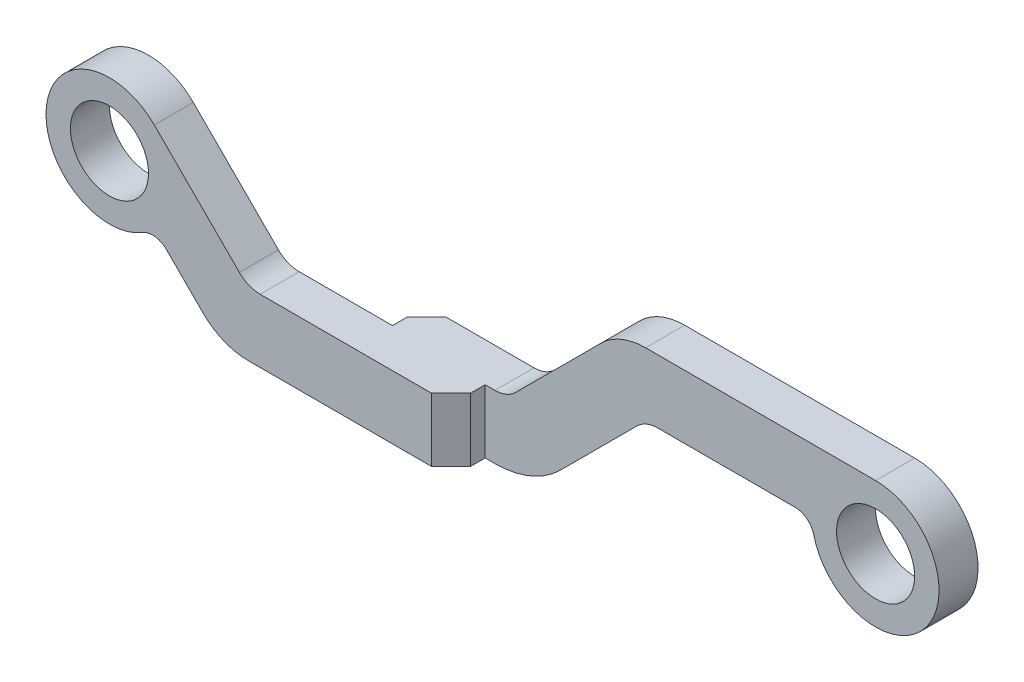
ISO-10303-21;
HEADER;
FILE_DESCRIPTION(('STEP AP214'),'2;1');
FILE_NAME('part.step','',(''),(''),'','','');
FILE_SCHEMA(('AUTOMOTIVE_DESIGN { 1 0 10303 214 1 1 1 1 }'));
ENDSEC;
DATA;
#1=APPLICATION_CONTEXT('core data for automotive mechanical design processes');
#2=APPLICATION_PROTOCOL_DEFINITION('international standard','automotive_design',2000,#1);
#3=PRODUCT_CONTEXT('',#1,'mechanical');
#4=PRODUCT('Part','Part','',(#3));
#5=PRODUCT_RELATED_PRODUCT_CATEGORY('part','',(#4));
#6=PRODUCT_DEFINITION_FORMATION('','',#4);
#7=PRODUCT_DEFINITION_CONTEXT('part definition',#1,'design');
#8=PRODUCT_DEFINITION('design','',#6,#7);
#9=PRODUCT_DEFINITION_SHAPE('','',#8);
#10=(LENGTH_UNIT() NAMED_UNIT(*) SI_UNIT(.MILLI.,.METRE.));
#11=(NAMED_UNIT(*) PLANE_ANGLE_UNIT() SI_UNIT($,.RADIAN.));
#12=(NAMED_UNIT(*) SI_UNIT($,.STERADIAN.) SOLID_ANGLE_UNIT());
#13=UNCERTAINTY_MEASURE_WITH_UNIT(LENGTH_MEASURE(1.E-05),#10,'distance_accuracy_value','');
#14=(GEOMETRIC_REPRESENTATION_CONTEXT(3) GLOBAL_UNCERTAINTY_ASSIGNED_CONTEXT((#13)) GLOBAL_UNIT_ASSIGNED_CONTEXT((#10,
#11,#12)) REPRESENTATION_CONTEXT('',''));
#15=CARTESIAN_POINT('',(0.,0.,0.));
#16=DIRECTION('',(0.,0.,1.));
#17=DIRECTION('',(1.,0.,0.));
#18=AXIS2_PLACEMENT_3D('',#15,#16,#17);
#19=CARTESIAN_POINT('',(68.5,0.,-3.5));
#20=DIRECTION('',(0.,1.,0.));
#21=DIRECTION('',(1.,0.,0.));
#22=AXIS2_PLACEMENT_3D('',#19,#20,#21);
#23=PLANE('',#22);
#24=DIRECTION('',(-1.,0.,0.));
#25=VECTOR('',#24,1.);
#26=CARTESIAN_POINT('',(68.5,0.,0.5));
#27=LINE('',#26,#25);
#28=CARTESIAN_POINT('',(66.7386441790708,0.,0.5));
#29=VERTEX_POINT('',#28);
#30=CARTESIAN_POINT('',(52.6776695296637,0.,0.5));
#31=VERTEX_POINT('',#30);
#32=EDGE_CURVE('E290',#29,#31,#27,.T.);
#33=ORIENTED_EDGE('',*,*,#32,.T.);
#34=DIRECTION('',(0.,0.,1.));
#35=VECTOR('',#34,1.);
#36=CARTESIAN_POINT('',(52.6776695296637,0.,-3.5));
#37=LINE('',#36,#35);
#38=CARTESIAN_POINT('',(52.6776695296637,0.,-3.5));
#39=VERTEX_POINT('',#38);
#40=EDGE_CURVE('E510',#31,#39,#37,.F.);
#41=ORIENTED_EDGE('',*,*,#40,.T.);
#42=DIRECTION('',(-1.,0.,0.));
#43=VECTOR('',#42,1.);
#44=CARTESIAN_POINT('',(68.5,0.,-3.5));
#45=LINE('',#44,#43);
#46=CARTESIAN_POINT('',(66.7386441790708,0.,-3.5));
#47=VERTEX_POINT('',#46);
#48=EDGE_CURVE('E329',#47,#39,#45,.T.);
#49=ORIENTED_EDGE('',*,*,#48,.F.);
#50=DIRECTION('',(0.,0.,-1.));
#51=VECTOR('',#50,1.);
#52=CARTESIAN_POINT('',(66.7386441790708,0.,-3.5));
#53=LINE('',#52,#51);
#54=EDGE_CURVE('E495',#47,#29,#53,.F.);
#55=ORIENTED_EDGE('',*,*,#54,.T.);
#56=EDGE_LOOP('',(#33,#41,#49,#55));
#57=FACE_BOUND('',#56,.T.);
#58=ADVANCED_FACE('F67',(#57),#23,.F.);
#59=CARTESIAN_POINT('',(42.7175144212722,-8.71751442127222,-3.5));
#60=DIRECTION('',(-0.707106781186547,0.707106781186548,0.));
#61=DIRECTION('',(0.,0.,1.));
#62=AXIS2_PLACEMENT_3D('',#59,#60,#61);
#63=PLANE('',#62);
#64=DIRECTION('',(-0.707106781186548,-0.707106781186547,0.));
#65=VECTOR('',#64,1.);
#66=CARTESIAN_POINT('',(42.7175144212722,-8.71751442127222,0.5));
#67=LINE('',#66,#65);
#68=CARTESIAN_POINT('',(50.5563491861041,-0.87867965644035,0.5));
#69=VERTEX_POINT('',#68);
#70=CARTESIAN_POINT('',(42.7175144212722,-8.7175144212722,0.5));
#71=VERTEX_POINT('',#70);
#72=EDGE_CURVE('E339',#69,#71,#67,.T.);
#73=ORIENTED_EDGE('',*,*,#72,.T.);
#74=DIRECTION('',(0.,0.,1.));
#75=VECTOR('',#74,1.);
#76=CARTESIAN_POINT('',(42.7175144212722,-8.7175144212722,-3.5));
#77=LINE('',#76,#75);
#78=CARTESIAN_POINT('',(42.7175144212722,-8.7175144212722,-3.5));
#79=VERTEX_POINT('',#78);
#80=EDGE_CURVE('E75',#71,#79,#77,.F.);
#81=ORIENTED_EDGE('',*,*,#80,.T.);
#82=DIRECTION('',(-0.707106781186548,-0.707106781186547,0.));
#83=VECTOR('',#82,1.);
#84=CARTESIAN_POINT('',(42.7175144212722,-8.71751442127222,-3.5));
#85=LINE('',#84,#83);
#86=CARTESIAN_POINT('',(50.5563491861041,-0.87867965644035,-3.5));
#87=VERTEX_POINT('',#86);
#88=EDGE_CURVE('E335',#87,#79,#85,.T.);
#89=ORIENTED_EDGE('',*,*,#88,.F.);
#90=DIRECTION('',(0.,0.,1.));
#91=VECTOR('',#90,1.);
#92=CARTESIAN_POINT('',(50.5563491861041,-0.878679656440348,0.5));
#93=LINE('',#92,#91);
#94=EDGE_CURVE('E507',#87,#69,#93,.T.);
#95=ORIENTED_EDGE('',*,*,#94,.T.);
#96=EDGE_LOOP('',(#73,#81,#89,#95));
#97=FACE_BOUND('',#96,.T.);
#98=ADVANCED_FACE('F619',(#97),#63,.F.);
#99=CARTESIAN_POINT('',(46.8388347648319,4.59619407771255,-44.160177077824));
#100=DIRECTION('',(-0.707106781186547,0.707106781186548,0.));
#101=DIRECTION('',(0.,0.,1.));
#102=AXIS2_PLACEMENT_3D('',#99,#100,#101);
#103=PLANE('',#102);
#104=DIRECTION('',(-0.707106781186548,-0.707106781186547,0.));
#105=VECTOR('',#104,1.);
#106=CARTESIAN_POINT('',(46.8388347648319,4.59619407771255,0.5));
#107=LINE('',#106,#105);
#108=CARTESIAN_POINT('',(46.8388347648319,4.59619407771256,0.5));
#109=VERTEX_POINT('',#108);
#110=CARTESIAN_POINT('',(38.1213203435597,-4.12132034355964,0.5));
#111=VERTEX_POINT('',#110);
#112=EDGE_CURVE('E356',#109,#111,#107,.T.);
#113=ORIENTED_EDGE('',*,*,#112,.F.);
#114=DIRECTION('',(0.,0.,-1.));
#115=VECTOR('',#114,1.);
#116=CARTESIAN_POINT('',(46.8388347648319,4.59619407771256,-44.160177077824));
#117=LINE('',#116,#115);
#118=CARTESIAN_POINT('',(46.8388347648319,4.59619407771256,-3.5));
#119=VERTEX_POINT('',#118);
#120=EDGE_CURVE('E543',#109,#119,#117,.T.);
#121=ORIENTED_EDGE('',*,*,#120,.T.);
#122=DIRECTION('',(-0.707106781186548,-0.707106781186547,0.));
#123=VECTOR('',#122,1.);
#124=CARTESIAN_POINT('',(46.8388347648319,4.59619407771255,-3.5));
#125=LINE('',#124,#123);
#126=CARTESIAN_POINT('',(38.1213203435597,-4.12132034355964,-3.5));
#127=VERTEX_POINT('',#126);
#128=EDGE_CURVE('E588',#119,#127,#125,.T.);
#129=ORIENTED_EDGE('',*,*,#128,.T.);
#130=DIRECTION('',(0.,0.,1.));
#131=VECTOR('',#130,1.);
#132=CARTESIAN_POINT('',(38.1213203435597,-4.12132034355964,0.5));
#133=LINE('',#132,#131);
#134=EDGE_CURVE('E518',#127,#111,#133,.T.);
#135=ORIENTED_EDGE('',*,*,#134,.T.);
#136=EDGE_LOOP('',(#113,#121,#129,#135));
#137=FACE_BOUND('',#136,.T.);
#138=ADVANCED_FACE('F626',(#137),#103,.T.);
#139=CARTESIAN_POINT('',(75.,6.5,-44.160177077824));
#140=DIRECTION('',(0.,1.,0.));
#141=DIRECTION('',(1.,0.,0.));
#142=AXIS2_PLACEMENT_3D('',#139,#140,#141);
#143=PLANE('',#142);
#144=DIRECTION('',(-1.,0.,0.));
#145=VECTOR('',#144,1.);
#146=CARTESIAN_POINT('',(75.,6.5,-3.5));
#147=LINE('',#146,#145);
#148=CARTESIAN_POINT('',(75.,6.5,-3.5));
#149=VERTEX_POINT('',#148);
#150=CARTESIAN_POINT('',(51.4350288425445,6.5,-3.5));
#151=VERTEX_POINT('',#150);
#152=EDGE_CURVE('E336',#149,#151,#147,.T.);
#153=ORIENTED_EDGE('',*,*,#152,.T.);
#154=DIRECTION('',(0.,0.,-1.));
#155=VECTOR('',#154,1.);
#156=CARTESIAN_POINT('',(51.4350288425445,6.5,-44.160177077824));
#157=LINE('',#156,#155);
#158=CARTESIAN_POINT('',(51.4350288425445,6.5,0.5));
#159=VERTEX_POINT('',#158);
#160=EDGE_CURVE('E548',#151,#159,#157,.F.);
#161=ORIENTED_EDGE('',*,*,#160,.T.);
#162=DIRECTION('',(-1.,0.,0.));
#163=VECTOR('',#162,1.);
#164=CARTESIAN_POINT('',(75.,6.5,0.5));
#165=LINE('',#164,#163);
#166=CARTESIAN_POINT('',(75.,6.5,0.5));
#167=VERTEX_POINT('',#166);
#168=EDGE_CURVE('E477',#167,#159,#165,.T.);
#169=ORIENTED_EDGE('',*,*,#168,.F.);
#170=DIRECTION('',(0.,0.,1.));
#171=VECTOR('',#170,1.);
#172=CARTESIAN_POINT('',(75.,6.5,-44.160177077824));
#173=LINE('',#172,#171);
#174=EDGE_CURVE('E446',#149,#167,#173,.T.);
#175=ORIENTED_EDGE('',*,*,#174,.F.);
#176=EDGE_LOOP('',(#153,#161,#169,#175));
#177=FACE_BOUND('',#176,.T.);
#178=ADVANCED_FACE('F757',(#177),#143,.T.);
#179=CARTESIAN_POINT('',(35.,6.501,2.));
#180=DIRECTION('',(0.707106781186548,0.,0.707106781186548));
#181=DIRECTION('',(0.,-1.,0.));
#182=AXIS2_PLACEMENT_3D('',#179,#180,#181);
#183=PLANE('',#182);
#184=DIRECTION('',(0.707106781186548,0.,-0.707106781186548));
#185=VECTOR('',#184,1.);
#186=CARTESIAN_POINT('',(16.5,-5.,20.5));
#187=LINE('',#186,#185);
#188=CARTESIAN_POINT('',(33.,-5.,4.));
#189=VERTEX_POINT('',#188);
#190=CARTESIAN_POINT('',(35.,-5.,2.));
#191=VERTEX_POINT('',#190);
#192=EDGE_CURVE('E380',#189,#191,#187,.T.);
#193=ORIENTED_EDGE('',*,*,#192,.F.);
#194=DIRECTION('',(0.,1.,0.));
#195=VECTOR('',#194,1.);
#196=CARTESIAN_POINT('',(33.,-5.,4.));
#197=LINE('',#196,#195);
#198=CARTESIAN_POINT('',(33.,-11.5,4.));
#199=VERTEX_POINT('',#198);
#200=EDGE_CURVE('E732',#199,#189,#197,.T.);
#201=ORIENTED_EDGE('',*,*,#200,.F.);
#202=DIRECTION('',(-0.707106781186548,0.,0.707106781186548));
#203=VECTOR('',#202,1.);
#204=CARTESIAN_POINT('',(35.,-11.5,2.));
#205=LINE('',#204,#203);
#206=CARTESIAN_POINT('',(35.,-11.5,2.));
#207=VERTEX_POINT('',#206);
#208=EDGE_CURVE('E404',#207,#199,#205,.T.);
#209=ORIENTED_EDGE('',*,*,#208,.F.);
#210=DIRECTION('',(0.,-1.,0.));
#211=VECTOR('',#210,1.);
#212=CARTESIAN_POINT('',(35.,-11.5,2.));
#213=LINE('',#212,#211);
#214=EDGE_CURVE('E482',#191,#207,#213,.T.);
#215=ORIENTED_EDGE('',*,*,#214,.F.);
#216=EDGE_LOOP('',(#193,#201,#209,#215));
#217=FACE_BOUND('',#216,.T.);
#218=ADVANCED_FACE('F918',(#217),#183,.T.);
#219=CARTESIAN_POINT('',(27.,-2.,-3.5));
#220=DIRECTION('',(-0.707106781186548,0.,-0.707106781186548));
#221=DIRECTION('',(-0.707106781186548,0.,0.707106781186548));
#222=AXIS2_PLACEMENT_3D('',#219,#220,#221);
#223=PLANE('',#222);
#224=DIRECTION('',(0.707106781186548,0.,-0.707106781186548));
#225=VECTOR('',#224,1.);
#226=CARTESIAN_POINT('',(27.,-11.5,-3.5));
#227=LINE('',#226,#225);
#228=CARTESIAN_POINT('',(25.,-11.5,-1.49999999999998));
#229=VERTEX_POINT('',#228);
#230=CARTESIAN_POINT('',(27.,-11.5,-3.5));
#231=VERTEX_POINT('',#230);
#232=EDGE_CURVE('E678',#229,#231,#227,.T.);
#233=ORIENTED_EDGE('',*,*,#232,.F.);
#234=DIRECTION('',(0.,-1.,0.));
#235=VECTOR('',#234,1.);
#236=CARTESIAN_POINT('',(25.,-11.5,-1.49999999999998));
#237=LINE('',#236,#235);
#238=CARTESIAN_POINT('',(25.,-5.,-1.49999999999998));
#239=VERTEX_POINT('',#238);
#240=EDGE_CURVE('E737',#239,#229,#237,.T.);
#241=ORIENTED_EDGE('',*,*,#240,.F.);
#242=DIRECTION('',(-0.707106781186548,0.,0.707106781186548));
#243=VECTOR('',#242,1.);
#244=CARTESIAN_POINT('',(9.75,-5.,13.75));
#245=LINE('',#244,#243);
#246=CARTESIAN_POINT('',(27.,-5.,-3.5));
#247=VERTEX_POINT('',#246);
#248=EDGE_CURVE('E704',#247,#239,#245,.T.);
#249=ORIENTED_EDGE('',*,*,#248,.F.);
#250=DIRECTION('',(0.,1.,0.));
#251=VECTOR('',#250,1.);
#252=CARTESIAN_POINT('',(27.,-5.,-3.5));
#253=LINE('',#252,#251);
#254=EDGE_CURVE('E593',#231,#247,#253,.T.);
#255=ORIENTED_EDGE('',*,*,#254,.F.);
#256=EDGE_LOOP('',(#233,#241,#249,#255));
#257=FACE_BOUND('',#256,.T.);
#258=ADVANCED_FACE('F616',(#257),#223,.T.);
#259=CARTESIAN_POINT('',(35.,6.501,4.));
#260=DIRECTION('',(-1.,0.,0.));
#261=DIRECTION('',(0.,0.,1.));
#262=AXIS2_PLACEMENT_3D('',#259,#260,#261);
#263=PLANE('',#262);
#264=DIRECTION('',(0.,0.,-1.));
#265=VECTOR('',#264,1.);
#266=CARTESIAN_POINT('',(35.,-5.,4.));
#267=LINE('',#266,#265);
#268=CARTESIAN_POINT('',(35.,-5.,0.5));
#269=VERTEX_POINT('',#268);
#270=EDGE_CURVE('E385',#191,#269,#267,.T.);
#271=ORIENTED_EDGE('',*,*,#270,.F.);
#272=ORIENTED_EDGE('',*,*,#214,.T.);
#273=DIRECTION('',(0.,0.,-1.));
#274=VECTOR('',#273,1.);
#275=CARTESIAN_POINT('',(35.,-11.5,4.));
#276=LINE('',#275,#274);
#277=CARTESIAN_POINT('',(35.,-11.5,0.5));
#278=VERTEX_POINT('',#277);
#279=EDGE_CURVE('E378',#207,#278,#276,.T.);
#280=ORIENTED_EDGE('',*,*,#279,.T.);
#281=DIRECTION('',(0.,-1.,0.));
#282=VECTOR('',#281,1.);
#283=CARTESIAN_POINT('',(35.,6.501,0.5));
#284=LINE('',#283,#282);
#285=EDGE_CURVE('E486',#269,#278,#284,.T.);
#286=ORIENTED_EDGE('',*,*,#285,.F.);
#287=EDGE_LOOP('',(#271,#272,#280,#286));
#288=FACE_BOUND('',#287,.T.);
#289=ADVANCED_FACE('F575',(#288),#263,.F.);
#290=CARTESIAN_POINT('',(35.,6.501,0.5));
#291=DIRECTION('',(0.,0.,-1.));
#292=DIRECTION('',(0.,-1.,0.));
#293=AXIS2_PLACEMENT_3D('',#290,#291,#292);
#294=PLANE('',#293);
#295=CARTESIAN_POINT('',(75.,0.,0.500000000000001));
#296=DIRECTION('',(0.,0.,1.));
#297=DIRECTION('',(1.,0.,0.));
#298=AXIS2_PLACEMENT_3D('',#295,#296,#297);
#299=CIRCLE('',#298,3.99999999999999);
#300=CARTESIAN_POINT('',(79.,0.,0.500000000000001));
#301=VERTEX_POINT('',#300);
#302=EDGE_CURVE('E599',#301,#301,#299,.T.);
#303=ORIENTED_EDGE('',*,*,#302,.F.);
#304=EDGE_LOOP('',(#303));
#305=FACE_BOUND('',#304,.T.);
#306=DIRECTION('',(1.,0.,0.));
#307=VECTOR('',#306,1.);
#308=CARTESIAN_POINT('',(35.,-11.5,0.5));
#309=LINE('',#308,#307);
#310=CARTESIAN_POINT('',(36.,-11.5,0.5));
#311=VERTEX_POINT('',#310);
#312=EDGE_CURVE('E259',#278,#311,#309,.T.);
#313=ORIENTED_EDGE('',*,*,#312,.T.);
#314=CARTESIAN_POINT('',(36.,-2.,0.5));
#315=DIRECTION('',(0.,0.,-1.));
#316=DIRECTION('',(-1.,0.,0.));
#317=AXIS2_PLACEMENT_3D('',#314,#315,#316);
#318=CIRCLE('',#317,9.5);
#319=EDGE_CURVE('E89',#311,#71,#318,.F.);
#320=ORIENTED_EDGE('',*,*,#319,.T.);
#321=ORIENTED_EDGE('',*,*,#72,.F.);
#322=CARTESIAN_POINT('',(52.6776695296637,-2.99999999999999,0.5));
#323=DIRECTION('',(0.,0.,-1.));
#324=DIRECTION('',(-1.,0.,0.));
#325=AXIS2_PLACEMENT_3D('',#322,#323,#324);
#326=CIRCLE('',#325,3.);
#327=EDGE_CURVE('E521',#69,#31,#326,.T.);
#328=ORIENTED_EDGE('',*,*,#327,.T.);
#329=ORIENTED_EDGE('',*,*,#32,.F.);
#330=CARTESIAN_POINT('',(66.7386441790708,-1.99999999999999,0.5));
#331=DIRECTION('',(0.,0.,-1.));
#332=DIRECTION('',(-1.,0.,0.));
#333=AXIS2_PLACEMENT_3D('',#330,#331,#332);
#334=CIRCLE('',#333,2.);
#335=CARTESIAN_POINT('',(68.6824926075248,-1.52941176470587,0.5));
#336=VERTEX_POINT('',#335);
#337=EDGE_CURVE('E503',#29,#336,#334,.T.);
#338=ORIENTED_EDGE('',*,*,#337,.T.);
#339=CARTESIAN_POINT('',(75.,0.,0.5));
#340=DIRECTION('',(0.,0.,-1.));
#341=DIRECTION('',(-1.,0.,0.));
#342=AXIS2_PLACEMENT_3D('',#339,#340,#341);
#343=CIRCLE('',#342,6.5);
#344=EDGE_CURVE('E440',#167,#336,#343,.T.);
#345=ORIENTED_EDGE('',*,*,#344,.F.);
#346=ORIENTED_EDGE('',*,*,#168,.T.);
#347=CARTESIAN_POINT('',(51.4350288425445,0.,0.5));
#348=DIRECTION('',(0.,0.,-1.));
#349=DIRECTION('',(-1.,0.,0.));
#350=AXIS2_PLACEMENT_3D('',#347,#348,#349);
#351=CIRCLE('',#350,6.5);
#352=EDGE_CURVE('E550',#159,#109,#351,.F.);
#353=ORIENTED_EDGE('',*,*,#352,.T.);
#354=ORIENTED_EDGE('',*,*,#112,.T.);
#355=CARTESIAN_POINT('',(36.,-2.,0.5));
#356=DIRECTION('',(0.,0.,-1.));
#357=DIRECTION('',(-1.,0.,0.));
#358=AXIS2_PLACEMENT_3D('',#355,#356,#357);
#359=CIRCLE('',#358,3.);
#360=CARTESIAN_POINT('',(36.,-5.,0.5));
#361=VERTEX_POINT('',#360);
#362=EDGE_CURVE('E529',#111,#361,#359,.T.);
#363=ORIENTED_EDGE('',*,*,#362,.T.);
#364=DIRECTION('',(1.,0.,0.));
#365=VECTOR('',#364,1.);
#366=CARTESIAN_POINT('',(35.,-5.,0.5));
#367=LINE('',#366,#365);
#368=EDGE_CURVE('E569',#269,#361,#367,.T.);
#369=ORIENTED_EDGE('',*,*,#368,.F.);
#370=ORIENTED_EDGE('',*,*,#285,.T.);
#371=EDGE_LOOP('',(#313,#320,#321,#328,#329,#338,#345,#346,#353,#354,#363,#369,#370));
#372=FACE_BOUND('',#371,.T.);
#373=ADVANCED_FACE('F565',(#305,#372),#294,.F.);
#374=CARTESIAN_POINT('',(59.5649711574556,-2.,-3.5));
#375=DIRECTION('',(0.,0.,-1.));
#376=DIRECTION('',(0.,-1.,0.));
#377=AXIS2_PLACEMENT_3D('',#374,#375,#376);
#378=PLANE('',#377);
#379=CARTESIAN_POINT('',(75.,0.,-3.5));
#380=DIRECTION('',(0.,0.,1.));
#381=DIRECTION('',(1.,0.,0.));
#382=AXIS2_PLACEMENT_3D('',#379,#380,#381);
#383=CIRCLE('',#382,3.99999999999999);
#384=CARTESIAN_POINT('',(79.,0.,-3.5));
#385=VERTEX_POINT('',#384);
#386=EDGE_CURVE('E596',#385,#385,#383,.T.);
#387=ORIENTED_EDGE('',*,*,#386,.T.);
#388=EDGE_LOOP('',(#387));
#389=FACE_BOUND('',#388,.T.);
#390=ORIENTED_EDGE('',*,*,#88,.T.);
#391=CARTESIAN_POINT('',(36.,-2.,-3.5));
#392=DIRECTION('',(0.,0.,-1.));
#393=DIRECTION('',(-1.,0.,0.));
#394=AXIS2_PLACEMENT_3D('',#391,#392,#393);
#395=CIRCLE('',#394,9.5);
#396=CARTESIAN_POINT('',(36.,-11.5,-3.5));
#397=VERTEX_POINT('',#396);
#398=EDGE_CURVE('E12',#79,#397,#395,.T.);
#399=ORIENTED_EDGE('',*,*,#398,.T.);
#400=DIRECTION('',(-1.,0.,0.));
#401=VECTOR('',#400,1.);
#402=CARTESIAN_POINT('',(60.8076118445749,-11.5,-3.5));
#403=LINE('',#402,#401);
#404=EDGE_CURVE('E562',#397,#231,#403,.T.);
#405=ORIENTED_EDGE('',*,*,#404,.T.);
#406=ORIENTED_EDGE('',*,*,#254,.T.);
#407=DIRECTION('',(1.,0.,0.));
#408=VECTOR('',#407,1.);
#409=CARTESIAN_POINT('',(25.,-5.,-3.5));
#410=LINE('',#409,#408);
#411=CARTESIAN_POINT('',(36.,-5.,-3.5));
#412=VERTEX_POINT('',#411);
#413=EDGE_CURVE('E683',#247,#412,#410,.T.);
#414=ORIENTED_EDGE('',*,*,#413,.T.);
#415=CARTESIAN_POINT('',(36.,-2.,-3.5));
#416=DIRECTION('',(0.,0.,-1.));
#417=DIRECTION('',(-1.,0.,0.));
#418=AXIS2_PLACEMENT_3D('',#415,#416,#417);
#419=CIRCLE('',#418,3.);
#420=EDGE_CURVE('E531',#412,#127,#419,.F.);
#421=ORIENTED_EDGE('',*,*,#420,.T.);
#422=ORIENTED_EDGE('',*,*,#128,.F.);
#423=CARTESIAN_POINT('',(51.4350288425445,0.,-3.5));
#424=DIRECTION('',(0.,0.,-1.));
#425=DIRECTION('',(-1.,0.,0.));
#426=AXIS2_PLACEMENT_3D('',#423,#424,#425);
#427=CIRCLE('',#426,6.5);
#428=EDGE_CURVE('E546',#119,#151,#427,.T.);
#429=ORIENTED_EDGE('',*,*,#428,.T.);
#430=ORIENTED_EDGE('',*,*,#152,.F.);
#431=CARTESIAN_POINT('',(75.,0.,-3.5));
#432=DIRECTION('',(0.,0.,-1.));
#433=DIRECTION('',(-1.,0.,0.));
#434=AXIS2_PLACEMENT_3D('',#431,#432,#433);
#435=CIRCLE('',#434,6.5);
#436=CARTESIAN_POINT('',(68.6824926075248,-1.52941176470587,-3.5));
#437=VERTEX_POINT('',#436);
#438=EDGE_CURVE('E359',#149,#437,#435,.T.);
#439=ORIENTED_EDGE('',*,*,#438,.T.);
#440=CARTESIAN_POINT('',(66.7386441790708,-1.99999999999999,-3.5));
#441=DIRECTION('',(0.,0.,-1.));
#442=DIRECTION('',(-1.,0.,0.));
#443=AXIS2_PLACEMENT_3D('',#440,#441,#442);
#444=CIRCLE('',#443,2.);
#445=EDGE_CURVE('E505',#437,#47,#444,.F.);
#446=ORIENTED_EDGE('',*,*,#445,.T.);
#447=ORIENTED_EDGE('',*,*,#48,.T.);
#448=CARTESIAN_POINT('',(52.6776695296637,-2.99999999999999,-3.5));
#449=DIRECTION('',(0.,0.,-1.));
#450=DIRECTION('',(-1.,0.,0.));
#451=AXIS2_PLACEMENT_3D('',#448,#449,#450);
#452=CIRCLE('',#451,3.);
#453=EDGE_CURVE('E523',#39,#87,#452,.F.);
#454=ORIENTED_EDGE('',*,*,#453,.T.);
#455=EDGE_LOOP('',(#390,#399,#405,#406,#414,#421,#422,#429,#430,#439,#446,#447,#454));
#456=FACE_BOUND('',#455,.T.);
#457=ADVANCED_FACE('F606',(#389,#456),#378,.T.);
#458=CARTESIAN_POINT('',(25.,-5.,-3.5));
#459=DIRECTION('',(1.,0.,0.));
#460=DIRECTION('',(0.,1.,0.));
#461=AXIS2_PLACEMENT_3D('',#458,#459,#460);
#462=PLANE('',#461);
#463=DIRECTION('',(0.,0.,1.));
#464=VECTOR('',#463,1.);
#465=CARTESIAN_POINT('',(25.,-5.,-3.5));
#466=LINE('',#465,#464);
#467=CARTESIAN_POINT('',(25.,-5.,0.));
#468=VERTEX_POINT('',#467);
#469=EDGE_CURVE('E708',#239,#468,#466,.T.);
#470=ORIENTED_EDGE('',*,*,#469,.F.);
#471=ORIENTED_EDGE('',*,*,#240,.T.);
#472=DIRECTION('',(0.,0.,1.));
#473=VECTOR('',#472,1.);
#474=CARTESIAN_POINT('',(25.,-11.5,-3.5));
#475=LINE('',#474,#473);
#476=CARTESIAN_POINT('',(25.,-11.5,0.));
#477=VERTEX_POINT('',#476);
#478=EDGE_CURVE('E685',#229,#477,#475,.T.);
#479=ORIENTED_EDGE('',*,*,#478,.T.);
#480=DIRECTION('',(0.,1.,0.));
#481=VECTOR('',#480,1.);
#482=CARTESIAN_POINT('',(25.,-5.,0.));
#483=LINE('',#482,#481);
#484=EDGE_CURVE('E283',#477,#468,#483,.T.);
#485=ORIENTED_EDGE('',*,*,#484,.T.);
#486=EDGE_LOOP('',(#470,#471,#479,#485));
#487=FACE_BOUND('',#486,.T.);
#488=ADVANCED_FACE('F612',(#487),#462,.F.);
#489=CARTESIAN_POINT('',(0.,0.,4.));
#490=DIRECTION('',(0.,0.,1.));
#491=DIRECTION('',(1.,0.,0.));
#492=AXIS2_PLACEMENT_3D('',#489,#490,#491);
#493=PLANE('',#492);
#494=CARTESIAN_POINT('',(0.,0.,4.));
#495=DIRECTION('',(0.,0.,1.));
#496=DIRECTION('',(1.,0.,0.));
#497=AXIS2_PLACEMENT_3D('',#494,#495,#496);
#498=CIRCLE('',#497,3.99999999999999);
#499=CARTESIAN_POINT('',(3.99999999999999,0.,4.));
#500=VERTEX_POINT('',#499);
#501=EDGE_CURVE('E490',#500,#500,#498,.T.);
#502=ORIENTED_EDGE('',*,*,#501,.F.);
#503=EDGE_LOOP('',(#502));
#504=FACE_BOUND('',#503,.T.);
#505=DIRECTION('',(0.707106781186544,-0.707106781186551,0.));
#506=VECTOR('',#505,1.);
#507=CARTESIAN_POINT('',(0.,0.,4.));
#508=LINE('',#507,#506);
#509=CARTESIAN_POINT('',(5.84166072277393,-5.84166072277399,4.));
#510=VERTEX_POINT('',#509);
#511=CARTESIAN_POINT('',(9.59619407771244,-9.59619407771253,4.));
#512=VERTEX_POINT('',#511);
#513=EDGE_CURVE('E727',#510,#512,#508,.T.);
#514=ORIENTED_EDGE('',*,*,#513,.T.);
#515=CARTESIAN_POINT('',(14.192388155425,-5.,4.));
#516=DIRECTION('',(0.,0.,1.));
#517=DIRECTION('',(1.,0.,0.));
#518=AXIS2_PLACEMENT_3D('',#515,#516,#517);
#519=CIRCLE('',#518,6.5);
#520=CARTESIAN_POINT('',(14.192388155425,-11.5,4.));
#521=VERTEX_POINT('',#520);
#522=EDGE_CURVE('E541',#512,#521,#519,.T.);
#523=ORIENTED_EDGE('',*,*,#522,.T.);
#524=DIRECTION('',(1.,0.,0.));
#525=VECTOR('',#524,1.);
#526=CARTESIAN_POINT('',(0.,-11.5,4.));
#527=LINE('',#526,#525);
#528=EDGE_CURVE('E400',#521,#199,#527,.T.);
#529=ORIENTED_EDGE('',*,*,#528,.T.);
#530=ORIENTED_EDGE('',*,*,#200,.T.);
#531=DIRECTION('',(1.,0.,0.));
#532=VECTOR('',#531,1.);
#533=CARTESIAN_POINT('',(0.,-5.,4.));
#534=LINE('',#533,#532);
#535=CARTESIAN_POINT('',(15.4350288425444,-5.,4.));
#536=VERTEX_POINT('',#535);
#537=EDGE_CURVE('E386',#536,#189,#534,.T.);
#538=ORIENTED_EDGE('',*,*,#537,.F.);
#539=CARTESIAN_POINT('',(15.4350288425444,-2.,4.));
#540=DIRECTION('',(0.,0.,1.));
#541=DIRECTION('',(1.,0.,0.));
#542=AXIS2_PLACEMENT_3D('',#539,#540,#541);
#543=CIRCLE('',#542,3.);
#544=CARTESIAN_POINT('',(13.3137084989848,-4.12132034355965,4.));
#545=VERTEX_POINT('',#544);
#546=EDGE_CURVE('E525',#536,#545,#543,.F.);
#547=ORIENTED_EDGE('',*,*,#546,.T.);
#548=DIRECTION('',(0.707106781186549,-0.707106781186546,0.));
#549=VECTOR('',#548,1.);
#550=CARTESIAN_POINT('',(4.59619407771255,4.59619407771257,4.));
#551=LINE('',#550,#549);
#552=CARTESIAN_POINT('',(4.59619407771255,4.59619407771257,4.));
#553=VERTEX_POINT('',#552);
#554=EDGE_CURVE('E270',#553,#545,#551,.T.);
#555=ORIENTED_EDGE('',*,*,#554,.F.);
#556=CARTESIAN_POINT('',(0.,0.,4.));
#557=DIRECTION('',(0.,0.,1.));
#558=DIRECTION('',(1.,0.,0.));
#559=AXIS2_PLACEMENT_3D('',#556,#557,#558);
#560=CIRCLE('',#559,6.5);
#561=CARTESIAN_POINT('',(3.38569488736534,-5.54860974746541,4.));
#562=VERTEX_POINT('',#561);
#563=EDGE_CURVE('E260',#553,#562,#560,.T.);
#564=ORIENTED_EDGE('',*,*,#563,.T.);
#565=CARTESIAN_POINT('',(4.42744716040083,-7.25587428514708,4.));
#566=DIRECTION('',(0.,0.,1.));
#567=DIRECTION('',(1.,0.,0.));
#568=AXIS2_PLACEMENT_3D('',#565,#566,#567);
#569=CIRCLE('',#568,2.);
#570=EDGE_CURVE('E501',#562,#510,#569,.F.);
#571=ORIENTED_EDGE('',*,*,#570,.T.);
#572=EDGE_LOOP('',(#514,#523,#529,#530,#538,#547,#555,#564,#571));
#573=FACE_BOUND('',#572,.T.);
#574=ADVANCED_FACE('F857',(#504,#573),#493,.T.);
#575=CARTESIAN_POINT('',(0.,0.,4.));
#576=DIRECTION('',(0.707106781186551,0.707106781186544,0.));
#577=DIRECTION('',(0.,0.,-1.));
#578=AXIS2_PLACEMENT_3D('',#575,#576,#577);
#579=PLANE('',#578);
#580=DIRECTION('',(0.707106781186544,-0.707106781186551,0.));
#581=VECTOR('',#580,1.);
#582=CARTESIAN_POINT('',(0.,0.,0.));
#583=LINE('',#582,#581);
#584=CARTESIAN_POINT('',(5.84166072277393,-5.84166072277399,0.));
#585=VERTEX_POINT('',#584);
#586=CARTESIAN_POINT('',(9.59619407771244,-9.59619407771253,0.));
#587=VERTEX_POINT('',#586);
#588=EDGE_CURVE('E276',#585,#587,#583,.T.);
#589=ORIENTED_EDGE('',*,*,#588,.T.);
#590=DIRECTION('',(0.,0.,-1.));
#591=VECTOR('',#590,1.);
#592=CARTESIAN_POINT('',(9.59619407771244,-9.59619407771253,4.));
#593=LINE('',#592,#591);
#594=EDGE_CURVE('E539',#587,#512,#593,.F.);
#595=ORIENTED_EDGE('',*,*,#594,.T.);
#596=ORIENTED_EDGE('',*,*,#513,.F.);
#597=DIRECTION('',(0.,0.,-1.));
#598=VECTOR('',#597,1.);
#599=CARTESIAN_POINT('',(5.84166072277393,-5.84166072277399,4.));
#600=LINE('',#599,#598);
#601=EDGE_CURVE('E485',#510,#585,#600,.T.);
#602=ORIENTED_EDGE('',*,*,#601,.T.);
#603=EDGE_LOOP('',(#589,#595,#596,#602));
#604=FACE_BOUND('',#603,.T.);
#605=ADVANCED_FACE('F845',(#604),#579,.F.);
#606=CARTESIAN_POINT('',(4.59619407771255,4.59619407771257,4.));
#607=DIRECTION('',(0.707106781186546,0.707106781186549,0.));
#608=DIRECTION('',(0.,0.,-1.));
#609=AXIS2_PLACEMENT_3D('',#606,#607,#608);
#610=PLANE('',#609);
#611=ORIENTED_EDGE('',*,*,#554,.T.);
#612=DIRECTION('',(0.,0.,1.));
#613=VECTOR('',#612,1.);
#614=CARTESIAN_POINT('',(13.3137084989848,-4.12132034355965,0.));
#615=LINE('',#614,#613);
#616=CARTESIAN_POINT('',(13.3137084989848,-4.12132034355965,0.));
#617=VERTEX_POINT('',#616);
#618=EDGE_CURVE('E274',#545,#617,#615,.F.);
#619=ORIENTED_EDGE('',*,*,#618,.T.);
#620=DIRECTION('',(0.707106781186549,-0.707106781186546,0.));
#621=VECTOR('',#620,1.);
#622=CARTESIAN_POINT('',(4.59619407771255,4.59619407771257,0.));
#623=LINE('',#622,#621);
#624=CARTESIAN_POINT('',(4.59619407771255,4.59619407771257,0.));
#625=VERTEX_POINT('',#624);
#626=EDGE_CURVE('E252',#625,#617,#623,.T.);
#627=ORIENTED_EDGE('',*,*,#626,.F.);
#628=DIRECTION('',(0.,0.,-1.));
#629=VECTOR('',#628,1.);
#630=CARTESIAN_POINT('',(4.59619407771255,4.59619407771257,4.));
#631=LINE('',#630,#629);
#632=EDGE_CURVE('E263',#553,#625,#631,.T.);
#633=ORIENTED_EDGE('',*,*,#632,.F.);
#634=EDGE_LOOP('',(#611,#619,#627,#633));
#635=FACE_BOUND('',#634,.T.);
#636=ADVANCED_FACE('F272',(#635),#610,.T.);
#637=CARTESIAN_POINT('',(0.,0.,0.));
#638=DIRECTION('',(0.,0.,1.));
#639=DIRECTION('',(1.,0.,0.));
#640=AXIS2_PLACEMENT_3D('',#637,#638,#639);
#641=PLANE('',#640);
#642=CARTESIAN_POINT('',(0.,0.,0.));
#643=DIRECTION('',(0.,0.,1.));
#644=DIRECTION('',(1.,0.,0.));
#645=AXIS2_PLACEMENT_3D('',#642,#643,#644);
#646=CIRCLE('',#645,3.99999999999999);
#647=CARTESIAN_POINT('',(3.99999999999999,0.,0.));
#648=VERTEX_POINT('',#647);
#649=EDGE_CURVE('E487',#648,#648,#646,.T.);
#650=ORIENTED_EDGE('',*,*,#649,.T.);
#651=EDGE_LOOP('',(#650));
#652=FACE_BOUND('',#651,.T.);
#653=DIRECTION('',(1.,0.,0.));
#654=VECTOR('',#653,1.);
#655=CARTESIAN_POINT('',(0.,-11.5,0.));
#656=LINE('',#655,#654);
#657=CARTESIAN_POINT('',(14.192388155425,-11.5,0.));
#658=VERTEX_POINT('',#657);
#659=EDGE_CURVE('E403',#658,#477,#656,.T.);
#660=ORIENTED_EDGE('',*,*,#659,.F.);
#661=CARTESIAN_POINT('',(14.192388155425,-5.,0.));
#662=DIRECTION('',(0.,0.,1.));
#663=DIRECTION('',(1.,0.,0.));
#664=AXIS2_PLACEMENT_3D('',#661,#662,#663);
#665=CIRCLE('',#664,6.5);
#666=EDGE_CURVE('E537',#658,#587,#665,.F.);
#667=ORIENTED_EDGE('',*,*,#666,.T.);
#668=ORIENTED_EDGE('',*,*,#588,.F.);
#669=CARTESIAN_POINT('',(4.42744716040083,-7.25587428514708,0.));
#670=DIRECTION('',(0.,0.,1.));
#671=DIRECTION('',(1.,0.,0.));
#672=AXIS2_PLACEMENT_3D('',#669,#670,#671);
#673=CIRCLE('',#672,2.);
#674=CARTESIAN_POINT('',(3.38569488736534,-5.54860974746541,0.));
#675=VERTEX_POINT('',#674);
#676=EDGE_CURVE('E255',#585,#675,#673,.T.);
#677=ORIENTED_EDGE('',*,*,#676,.T.);
#678=CARTESIAN_POINT('',(0.,0.,0.));
#679=DIRECTION('',(0.,0.,1.));
#680=DIRECTION('',(1.,0.,0.));
#681=AXIS2_PLACEMENT_3D('',#678,#679,#680);
#682=CIRCLE('',#681,6.5);
#683=EDGE_CURVE('E247',#625,#675,#682,.T.);
#684=ORIENTED_EDGE('',*,*,#683,.F.);
#685=ORIENTED_EDGE('',*,*,#626,.T.);
#686=CARTESIAN_POINT('',(15.4350288425444,-2.,0.));
#687=DIRECTION('',(0.,0.,1.));
#688=DIRECTION('',(1.,0.,0.));
#689=AXIS2_PLACEMENT_3D('',#686,#687,#688);
#690=CIRCLE('',#689,3.);
#691=CARTESIAN_POINT('',(15.4350288425444,-5.,0.));
#692=VERTEX_POINT('',#691);
#693=EDGE_CURVE('E527',#617,#692,#690,.T.);
#694=ORIENTED_EDGE('',*,*,#693,.T.);
#695=DIRECTION('',(1.,0.,0.));
#696=VECTOR('',#695,1.);
#697=CARTESIAN_POINT('',(0.,-5.,0.));
#698=LINE('',#697,#696);
#699=EDGE_CURVE('E712',#692,#468,#698,.T.);
#700=ORIENTED_EDGE('',*,*,#699,.T.);
#701=ORIENTED_EDGE('',*,*,#484,.F.);
#702=EDGE_LOOP('',(#660,#667,#668,#677,#684,#685,#694,#700,#701));
#703=FACE_BOUND('',#702,.T.);
#704=ADVANCED_FACE('F250',(#652,#703),#641,.F.);
#705=CARTESIAN_POINT('',(75.,0.,4.));
#706=DIRECTION('',(0.,0.,-1.));
#707=DIRECTION('',(-1.,0.,0.));
#708=AXIS2_PLACEMENT_3D('',#705,#706,#707);
#709=CYLINDRICAL_SURFACE('',#708,6.5);
#710=ORIENTED_EDGE('',*,*,#344,.T.);
#711=DIRECTION('',(0.,0.,-1.));
#712=VECTOR('',#711,1.);
#713=CARTESIAN_POINT('',(68.6824926075248,-1.52941176470587,4.));
#714=LINE('',#713,#712);
#715=EDGE_CURVE('E498',#336,#437,#714,.T.);
#716=ORIENTED_EDGE('',*,*,#715,.T.);
#717=ORIENTED_EDGE('',*,*,#438,.F.);
#718=ORIENTED_EDGE('',*,*,#174,.T.);
#719=EDGE_LOOP('',(#710,#716,#717,#718));
#720=FACE_BOUND('',#719,.T.);
#721=ADVANCED_FACE('F810',(#720),#709,.T.);
#722=CARTESIAN_POINT('',(0.,-5.,4.));
#723=DIRECTION('',(0.,1.,0.));
#724=DIRECTION('',(1.,0.,0.));
#725=AXIS2_PLACEMENT_3D('',#722,#723,#724);
#726=PLANE('',#725);
#727=ORIENTED_EDGE('',*,*,#699,.F.);
#728=DIRECTION('',(0.,0.,1.));
#729=VECTOR('',#728,1.);
#730=CARTESIAN_POINT('',(15.4350288425444,-5.,4.));
#731=LINE('',#730,#729);
#732=EDGE_CURVE('E514',#692,#536,#731,.T.);
#733=ORIENTED_EDGE('',*,*,#732,.T.);
#734=ORIENTED_EDGE('',*,*,#537,.T.);
#735=ORIENTED_EDGE('',*,*,#192,.T.);
#736=ORIENTED_EDGE('',*,*,#270,.T.);
#737=ORIENTED_EDGE('',*,*,#368,.T.);
#738=DIRECTION('',(0.,0.,1.));
#739=VECTOR('',#738,1.);
#740=CARTESIAN_POINT('',(36.,-5.,-3.5));
#741=LINE('',#740,#739);
#742=EDGE_CURVE('E512',#361,#412,#741,.F.);
#743=ORIENTED_EDGE('',*,*,#742,.T.);
#744=ORIENTED_EDGE('',*,*,#413,.F.);
#745=ORIENTED_EDGE('',*,*,#248,.T.);
#746=ORIENTED_EDGE('',*,*,#469,.T.);
#747=EDGE_LOOP('',(#727,#733,#734,#735,#736,#737,#743,#744,#745,#746));
#748=FACE_BOUND('',#747,.T.);
#749=ADVANCED_FACE('F751',(#748),#726,.T.);
#750=CARTESIAN_POINT('',(0.,-11.5,4.));
#751=DIRECTION('',(0.,1.,0.));
#752=DIRECTION('',(1.,0.,0.));
#753=AXIS2_PLACEMENT_3D('',#750,#751,#752);
#754=PLANE('',#753);
#755=ORIENTED_EDGE('',*,*,#404,.F.);
#756=DIRECTION('',(0.,0.,1.));
#757=VECTOR('',#756,1.);
#758=CARTESIAN_POINT('',(36.,-11.5,4.));
#759=LINE('',#758,#757);
#760=EDGE_CURVE('E552',#397,#311,#759,.T.);
#761=ORIENTED_EDGE('',*,*,#760,.T.);
#762=ORIENTED_EDGE('',*,*,#312,.F.);
#763=ORIENTED_EDGE('',*,*,#279,.F.);
#764=ORIENTED_EDGE('',*,*,#208,.T.);
#765=ORIENTED_EDGE('',*,*,#528,.F.);
#766=DIRECTION('',(0.,0.,-1.));
#767=VECTOR('',#766,1.);
#768=CARTESIAN_POINT('',(14.192388155425,-11.5,4.));
#769=LINE('',#768,#767);
#770=EDGE_CURVE('E534',#521,#658,#769,.T.);
#771=ORIENTED_EDGE('',*,*,#770,.T.);
#772=ORIENTED_EDGE('',*,*,#659,.T.);
#773=ORIENTED_EDGE('',*,*,#478,.F.);
#774=ORIENTED_EDGE('',*,*,#232,.T.);
#775=EDGE_LOOP('',(#755,#761,#762,#763,#764,#765,#771,#772,#773,#774));
#776=FACE_BOUND('',#775,.T.);
#777=ADVANCED_FACE('F559',(#776),#754,.F.);
#778=CARTESIAN_POINT('',(0.,0.,4.));
#779=DIRECTION('',(0.,0.,-1.));
#780=DIRECTION('',(-1.,0.,0.));
#781=AXIS2_PLACEMENT_3D('',#778,#779,#780);
#782=CYLINDRICAL_SURFACE('',#781,6.5);
#783=ORIENTED_EDGE('',*,*,#683,.T.);
#784=DIRECTION('',(0.,0.,-1.));
#785=VECTOR('',#784,1.);
#786=CARTESIAN_POINT('',(3.38569488736534,-5.54860974746541,4.));
#787=LINE('',#786,#785);
#788=EDGE_CURVE('E493',#675,#562,#787,.F.);
#789=ORIENTED_EDGE('',*,*,#788,.T.);
#790=ORIENTED_EDGE('',*,*,#563,.F.);
#791=ORIENTED_EDGE('',*,*,#632,.T.);
#792=EDGE_LOOP('',(#783,#789,#790,#791));
#793=FACE_BOUND('',#792,.T.);
#794=ADVANCED_FACE('F264',(#793),#782,.T.);
#795=CARTESIAN_POINT('',(0.,0.,4.));
#796=DIRECTION('',(0.,0.,1.));
#797=DIRECTION('',(1.,0.,0.));
#798=AXIS2_PLACEMENT_3D('',#795,#796,#797);
#799=CYLINDRICAL_SURFACE('',#798,3.99999999999999);
#800=ORIENTED_EDGE('',*,*,#501,.T.);
#801=EDGE_LOOP('',(#800));
#802=FACE_BOUND('',#801,.T.);
#803=ORIENTED_EDGE('',*,*,#649,.F.);
#804=EDGE_LOOP('',(#803));
#805=FACE_BOUND('',#804,.T.);
#806=ADVANCED_FACE('F784',(#802,#805),#799,.F.);
#807=CARTESIAN_POINT('',(75.,0.,0.5));
#808=DIRECTION('',(0.,0.,1.));
#809=DIRECTION('',(1.,0.,0.));
#810=AXIS2_PLACEMENT_3D('',#807,#808,#809);
#811=CYLINDRICAL_SURFACE('',#810,3.99999999999999);
#812=ORIENTED_EDGE('',*,*,#386,.F.);
#813=EDGE_LOOP('',(#812));
#814=FACE_BOUND('',#813,.T.);
#815=ORIENTED_EDGE('',*,*,#302,.T.);
#816=EDGE_LOOP('',(#815));
#817=FACE_BOUND('',#816,.T.);
#818=ADVANCED_FACE('F603',(#814,#817),#811,.F.);
#819=CARTESIAN_POINT('',(4.42744716040083,-7.25587428514708,4.));
#820=DIRECTION('',(0.,0.,-1.));
#821=DIRECTION('',(-1.,0.,0.));
#822=AXIS2_PLACEMENT_3D('',#819,#820,#821);
#823=CYLINDRICAL_SURFACE('',#822,2.);
#824=ORIENTED_EDGE('',*,*,#570,.F.);
#825=ORIENTED_EDGE('',*,*,#788,.F.);
#826=ORIENTED_EDGE('',*,*,#676,.F.);
#827=ORIENTED_EDGE('',*,*,#601,.F.);
#828=EDGE_LOOP('',(#824,#825,#826,#827));
#829=FACE_BOUND('',#828,.T.);
#830=ADVANCED_FACE('F631',(#829),#823,.F.);
#831=CARTESIAN_POINT('',(66.7386441790708,-1.99999999999999,4.));
#832=DIRECTION('',(0.,0.,-1.));
#833=DIRECTION('',(-1.,0.,0.));
#834=AXIS2_PLACEMENT_3D('',#831,#832,#833);
#835=CYLINDRICAL_SURFACE('',#834,2.);
#836=ORIENTED_EDGE('',*,*,#445,.F.);
#837=ORIENTED_EDGE('',*,*,#715,.F.);
#838=ORIENTED_EDGE('',*,*,#337,.F.);
#839=ORIENTED_EDGE('',*,*,#54,.F.);
#840=EDGE_LOOP('',(#836,#837,#838,#839));
#841=FACE_BOUND('',#840,.T.);
#842=ADVANCED_FACE('F634',(#841),#835,.F.);
#843=CARTESIAN_POINT('',(52.6776695296637,-2.99999999999999,-3.5));
#844=DIRECTION('',(0.,0.,-1.));
#845=DIRECTION('',(-1.,0.,0.));
#846=AXIS2_PLACEMENT_3D('',#843,#844,#845);
#847=CYLINDRICAL_SURFACE('',#846,3.);
#848=ORIENTED_EDGE('',*,*,#453,.F.);
#849=ORIENTED_EDGE('',*,*,#40,.F.);
#850=ORIENTED_EDGE('',*,*,#327,.F.);
#851=ORIENTED_EDGE('',*,*,#94,.F.);
#852=EDGE_LOOP('',(#848,#849,#850,#851));
#853=FACE_BOUND('',#852,.T.);
#854=ADVANCED_FACE('F637',(#853),#847,.F.);
#855=CARTESIAN_POINT('',(15.4350288425444,-2.,4.));
#856=DIRECTION('',(0.,0.,-1.));
#857=DIRECTION('',(-1.,0.,0.));
#858=AXIS2_PLACEMENT_3D('',#855,#856,#857);
#859=CYLINDRICAL_SURFACE('',#858,3.);
#860=ORIENTED_EDGE('',*,*,#693,.F.);
#861=ORIENTED_EDGE('',*,*,#618,.F.);
#862=ORIENTED_EDGE('',*,*,#546,.F.);
#863=ORIENTED_EDGE('',*,*,#732,.F.);
#864=EDGE_LOOP('',(#860,#861,#862,#863));
#865=FACE_BOUND('',#864,.T.);
#866=ADVANCED_FACE('F641',(#865),#859,.F.);
#867=CARTESIAN_POINT('',(36.,-2.,-44.160177077824));
#868=DIRECTION('',(0.,0.,-1.));
#869=DIRECTION('',(-1.,0.,0.));
#870=AXIS2_PLACEMENT_3D('',#867,#868,#869);
#871=CYLINDRICAL_SURFACE('',#870,3.);
#872=ORIENTED_EDGE('',*,*,#420,.F.);
#873=ORIENTED_EDGE('',*,*,#742,.F.);
#874=ORIENTED_EDGE('',*,*,#362,.F.);
#875=ORIENTED_EDGE('',*,*,#134,.F.);
#876=EDGE_LOOP('',(#872,#873,#874,#875));
#877=FACE_BOUND('',#876,.T.);
#878=ADVANCED_FACE('F645',(#877),#871,.F.);
#879=CARTESIAN_POINT('',(14.192388155425,-5.,4.));
#880=DIRECTION('',(0.,0.,-1.));
#881=DIRECTION('',(-1.,0.,0.));
#882=AXIS2_PLACEMENT_3D('',#879,#880,#881);
#883=CYLINDRICAL_SURFACE('',#882,6.5);
#884=ORIENTED_EDGE('',*,*,#522,.F.);
#885=ORIENTED_EDGE('',*,*,#594,.F.);
#886=ORIENTED_EDGE('',*,*,#666,.F.);
#887=ORIENTED_EDGE('',*,*,#770,.F.);
#888=EDGE_LOOP('',(#884,#885,#886,#887));
#889=FACE_BOUND('',#888,.T.);
#890=ADVANCED_FACE('F649',(#889),#883,.T.);
#891=CARTESIAN_POINT('',(51.4350288425445,0.,-44.160177077824));
#892=DIRECTION('',(0.,0.,-1.));
#893=DIRECTION('',(-1.,0.,0.));
#894=AXIS2_PLACEMENT_3D('',#891,#892,#893);
#895=CYLINDRICAL_SURFACE('',#894,6.5);
#896=ORIENTED_EDGE('',*,*,#352,.F.);
#897=ORIENTED_EDGE('',*,*,#160,.F.);
#898=ORIENTED_EDGE('',*,*,#428,.F.);
#899=ORIENTED_EDGE('',*,*,#120,.F.);
#900=EDGE_LOOP('',(#896,#897,#898,#899));
#901=FACE_BOUND('',#900,.T.);
#902=ADVANCED_FACE('F652',(#901),#895,.T.);
#903=CARTESIAN_POINT('',(36.,-2.,4.));
#904=DIRECTION('',(0.,0.,1.));
#905=DIRECTION('',(1.,0.,0.));
#906=AXIS2_PLACEMENT_3D('',#903,#904,#905);
#907=CYLINDRICAL_SURFACE('',#906,9.5);
#908=ORIENTED_EDGE('',*,*,#398,.F.);
#909=ORIENTED_EDGE('',*,*,#80,.F.);
#910=ORIENTED_EDGE('',*,*,#319,.F.);
#911=ORIENTED_EDGE('',*,*,#760,.F.);
#912=EDGE_LOOP('',(#908,#909,#910,#911));
#913=FACE_BOUND('',#912,.T.);
#914=ADVANCED_FACE('F69',(#913),#907,.T.);
#915=CLOSED_SHELL('',(#58,#98,#138,#178,#218,#258,#289,#373,#457,#488,#574,#605,#636,#704,#721,
#749,#777,#794,#806,#818,#830,#842,#854,#866,#878,#890,#902,#914));
#916=MANIFOLD_SOLID_BREP('B2',#915);
#917=ADVANCED_BREP_SHAPE_REPRESENTATION('',(#18,#916),#14);
#918=SHAPE_DEFINITION_REPRESENTATION(#9,#917);
ENDSEC;
END-ISO-10303-21;
